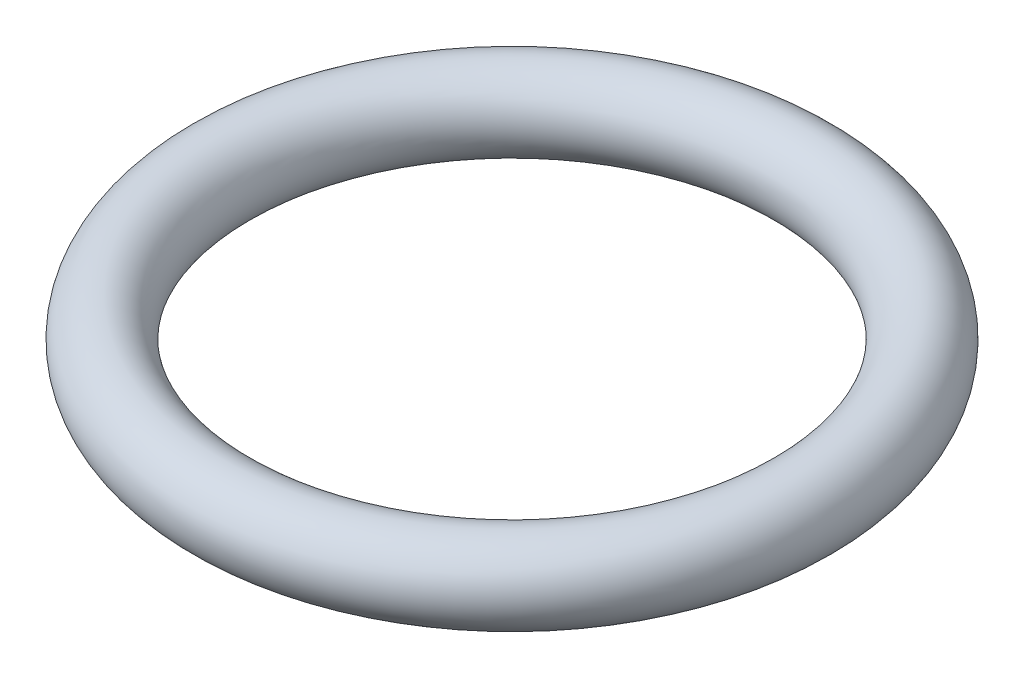
ISO-10303-21;
HEADER;
FILE_DESCRIPTION(('STEP AP214'),'2;1');
FILE_NAME('part.step','',(''),(''),'','','');
FILE_SCHEMA(('AUTOMOTIVE_DESIGN { 1 0 10303 214 1 1 1 1 }'));
ENDSEC;
DATA;
#1=APPLICATION_CONTEXT('core data for automotive mechanical design processes');
#2=APPLICATION_PROTOCOL_DEFINITION('international standard','automotive_design',2000,#1);
#3=PRODUCT_CONTEXT('',#1,'mechanical');
#4=PRODUCT('Part','Part','',(#3));
#5=PRODUCT_RELATED_PRODUCT_CATEGORY('part','',(#4));
#6=PRODUCT_DEFINITION_FORMATION('','',#4);
#7=PRODUCT_DEFINITION_CONTEXT('part definition',#1,'design');
#8=PRODUCT_DEFINITION('design','',#6,#7);
#9=PRODUCT_DEFINITION_SHAPE('','',#8);
#10=(LENGTH_UNIT() NAMED_UNIT(*) SI_UNIT(.MILLI.,.METRE.));
#11=(NAMED_UNIT(*) PLANE_ANGLE_UNIT() SI_UNIT($,.RADIAN.));
#12=(NAMED_UNIT(*) SI_UNIT($,.STERADIAN.) SOLID_ANGLE_UNIT());
#13=UNCERTAINTY_MEASURE_WITH_UNIT(LENGTH_MEASURE(1.E-05),#10,'distance_accuracy_value','');
#14=(GEOMETRIC_REPRESENTATION_CONTEXT(3) GLOBAL_UNCERTAINTY_ASSIGNED_CONTEXT((#13)) GLOBAL_UNIT_ASSIGNED_CONTEXT((#10,
#11,#12)) REPRESENTATION_CONTEXT('',''));
#15=CARTESIAN_POINT('',(0.,0.,0.));
#16=DIRECTION('',(0.,0.,1.));
#17=DIRECTION('',(1.,0.,0.));
#18=AXIS2_PLACEMENT_3D('',#15,#16,#17);
#19=CARTESIAN_POINT('',(0.,0.,0.));
#20=DIRECTION('',(0.,1.,0.));
#21=DIRECTION('',(-1.,0.,0.));
#22=AXIS2_PLACEMENT_3D('',#19,#20,#21);
#23=TOROIDAL_SURFACE('',#22,5.5,0.75);
#24=CARTESIAN_POINT('',(-6.25,0.,0.));
#25=VERTEX_POINT('',#24);
#26=VERTEX_LOOP('',#25);
#27=FACE_BOUND('',#26,.T.);
#28=ADVANCED_FACE('F29',(#27),#23,.T.);
#29=CLOSED_SHELL('',(#28));
#30=MANIFOLD_SOLID_BREP('B2',#29);
#31=ADVANCED_BREP_SHAPE_REPRESENTATION('',(#18,#30),#14);
#32=SHAPE_DEFINITION_REPRESENTATION(#9,#31);
ENDSEC;
END-ISO-10303-21;
